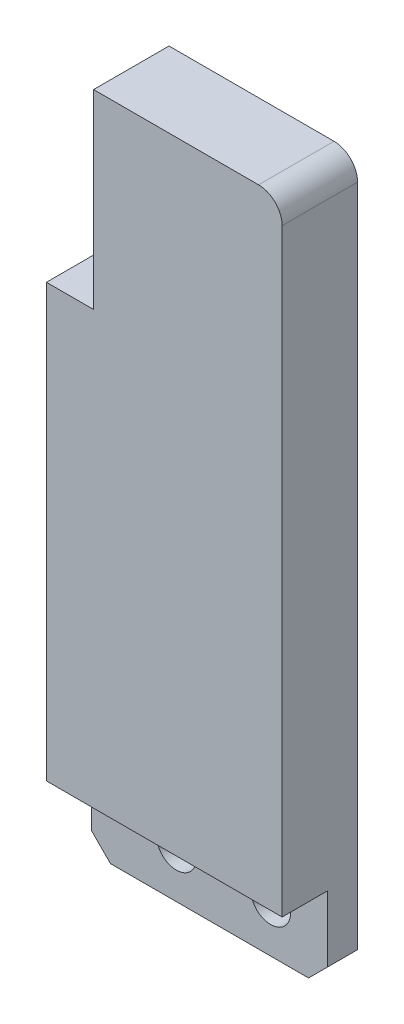
ISO-10303-21;
HEADER;
FILE_DESCRIPTION(('STEP AP214'),'2;1');
FILE_NAME('part.step','',(''),(''),'','','');
FILE_SCHEMA(('AUTOMOTIVE_DESIGN { 1 0 10303 214 1 1 1 1 }'));
ENDSEC;
DATA;
#1=APPLICATION_CONTEXT('core data for automotive mechanical design processes');
#2=APPLICATION_PROTOCOL_DEFINITION('international standard','automotive_design',2000,#1);
#3=PRODUCT_CONTEXT('',#1,'mechanical');
#4=PRODUCT('Part','Part','',(#3));
#5=PRODUCT_RELATED_PRODUCT_CATEGORY('part','',(#4));
#6=PRODUCT_DEFINITION_FORMATION('','',#4);
#7=PRODUCT_DEFINITION_CONTEXT('part definition',#1,'design');
#8=PRODUCT_DEFINITION('design','',#6,#7);
#9=PRODUCT_DEFINITION_SHAPE('','',#8);
#10=(LENGTH_UNIT() NAMED_UNIT(*) SI_UNIT(.MILLI.,.METRE.));
#11=(NAMED_UNIT(*) PLANE_ANGLE_UNIT() SI_UNIT($,.RADIAN.));
#12=(NAMED_UNIT(*) SI_UNIT($,.STERADIAN.) SOLID_ANGLE_UNIT());
#13=UNCERTAINTY_MEASURE_WITH_UNIT(LENGTH_MEASURE(1.E-05),#10,'distance_accuracy_value','');
#14=(GEOMETRIC_REPRESENTATION_CONTEXT(3) GLOBAL_UNCERTAINTY_ASSIGNED_CONTEXT((#13)) GLOBAL_UNIT_ASSIGNED_CONTEXT((#10,
#11,#12)) REPRESENTATION_CONTEXT('',''));
#15=CARTESIAN_POINT('',(0.,0.,0.));
#16=DIRECTION('',(0.,0.,1.));
#17=DIRECTION('',(1.,0.,0.));
#18=AXIS2_PLACEMENT_3D('',#15,#16,#17);
#19=CARTESIAN_POINT('',(12.5,-37.5,4.));
#20=DIRECTION('',(0.,1.,0.));
#21=DIRECTION('',(0.,0.,1.));
#22=AXIS2_PLACEMENT_3D('',#19,#20,#21);
#23=PLANE('',#22);
#24=DIRECTION('',(-1.,0.,0.));
#25=VECTOR('',#24,1.);
#26=CARTESIAN_POINT('',(-12.5,-37.5,-0.799999999999999));
#27=LINE('',#26,#25);
#28=CARTESIAN_POINT('',(10.5,-37.5,-0.799999999999999));
#29=VERTEX_POINT('',#28);
#30=CARTESIAN_POINT('',(-10.5,-37.5,-0.799999999999999));
#31=VERTEX_POINT('',#30);
#32=EDGE_CURVE('E163',#29,#31,#27,.T.);
#33=ORIENTED_EDGE('',*,*,#32,.T.);
#34=DIRECTION('',(0.,0.,-1.));
#35=VECTOR('',#34,1.);
#36=CARTESIAN_POINT('',(-10.5,-37.5,4.));
#37=LINE('',#36,#35);
#38=CARTESIAN_POINT('',(-10.5,-37.5,-4.));
#39=VERTEX_POINT('',#38);
#40=EDGE_CURVE('E219',#31,#39,#37,.T.);
#41=ORIENTED_EDGE('',*,*,#40,.T.);
#42=DIRECTION('',(1.,0.,0.));
#43=VECTOR('',#42,1.);
#44=CARTESIAN_POINT('',(12.5,-37.5,-4.));
#45=LINE('',#44,#43);
#46=CARTESIAN_POINT('',(10.5,-37.5,-4.));
#47=VERTEX_POINT('',#46);
#48=EDGE_CURVE('E202',#39,#47,#45,.T.);
#49=ORIENTED_EDGE('',*,*,#48,.T.);
#50=DIRECTION('',(0.,0.,1.));
#51=VECTOR('',#50,1.);
#52=CARTESIAN_POINT('',(10.5,-37.5,4.));
#53=LINE('',#52,#51);
#54=EDGE_CURVE('E217',#47,#29,#53,.T.);
#55=ORIENTED_EDGE('',*,*,#54,.T.);
#56=EDGE_LOOP('',(#33,#41,#49,#55));
#57=FACE_BOUND('',#56,.T.);
#58=ADVANCED_FACE('F41',(#57),#23,.F.);
#59=CARTESIAN_POINT('',(-12.5,-37.5,4.));
#60=DIRECTION('',(1.,0.,0.));
#61=DIRECTION('',(0.,0.,-1.));
#62=AXIS2_PLACEMENT_3D('',#59,#60,#61);
#63=PLANE('',#62);
#64=DIRECTION('',(0.,-1.,0.));
#65=VECTOR('',#64,1.);
#66=CARTESIAN_POINT('',(-12.5,-37.5,-4.));
#67=LINE('',#66,#65);
#68=CARTESIAN_POINT('',(-12.5,17.3,-4.));
#69=VERTEX_POINT('',#68);
#70=CARTESIAN_POINT('',(-12.5,-35.5,-4.));
#71=VERTEX_POINT('',#70);
#72=EDGE_CURVE('E186',#69,#71,#67,.T.);
#73=ORIENTED_EDGE('',*,*,#72,.T.);
#74=DIRECTION('',(0.,0.,1.));
#75=VECTOR('',#74,1.);
#76=CARTESIAN_POINT('',(-12.5,-35.5,4.));
#77=LINE('',#76,#75);
#78=CARTESIAN_POINT('',(-12.5,-35.5,-0.799999999999999));
#79=VERTEX_POINT('',#78);
#80=EDGE_CURVE('E65',#71,#79,#77,.T.);
#81=ORIENTED_EDGE('',*,*,#80,.T.);
#82=DIRECTION('',(0.,1.,0.));
#83=VECTOR('',#82,1.);
#84=CARTESIAN_POINT('',(-12.5,-37.5,-0.799999999999999));
#85=LINE('',#84,#83);
#86=CARTESIAN_POINT('',(-12.5,-28.5,-0.799999999999999));
#87=VERTEX_POINT('',#86);
#88=EDGE_CURVE('E161',#79,#87,#85,.T.);
#89=ORIENTED_EDGE('',*,*,#88,.T.);
#90=DIRECTION('',(0.,0.,1.));
#91=VECTOR('',#90,1.);
#92=CARTESIAN_POINT('',(-12.5,-28.5,-30.5706605111728));
#93=LINE('',#92,#91);
#94=CARTESIAN_POINT('',(-12.5,-28.5,4.));
#95=VERTEX_POINT('',#94);
#96=EDGE_CURVE('E159',#87,#95,#93,.T.);
#97=ORIENTED_EDGE('',*,*,#96,.T.);
#98=DIRECTION('',(0.,-1.,0.));
#99=VECTOR('',#98,1.);
#100=CARTESIAN_POINT('',(-12.5,-37.5,4.));
#101=LINE('',#100,#99);
#102=CARTESIAN_POINT('',(-12.5,17.3,4.));
#103=VERTEX_POINT('',#102);
#104=EDGE_CURVE('E191',#103,#95,#101,.T.);
#105=ORIENTED_EDGE('',*,*,#104,.F.);
#106=DIRECTION('',(0.,0.,1.));
#107=VECTOR('',#106,1.);
#108=CARTESIAN_POINT('',(-12.5,17.3,-4.));
#109=LINE('',#108,#107);
#110=EDGE_CURVE('E184',#69,#103,#109,.T.);
#111=ORIENTED_EDGE('',*,*,#110,.F.);
#112=EDGE_LOOP('',(#73,#81,#89,#97,#105,#111));
#113=FACE_BOUND('',#112,.T.);
#114=ADVANCED_FACE('F241',(#113),#63,.F.);
#115=CARTESIAN_POINT('',(12.5,-37.5,4.));
#116=DIRECTION('',(-1.,0.,0.));
#117=DIRECTION('',(0.,-1.,0.));
#118=AXIS2_PLACEMENT_3D('',#115,#116,#117);
#119=PLANE('',#118);
#120=DIRECTION('',(0.,-1.,0.));
#121=VECTOR('',#120,1.);
#122=CARTESIAN_POINT('',(12.5,-37.5,-0.799999999999999));
#123=LINE('',#122,#121);
#124=CARTESIAN_POINT('',(12.5,-28.5,-0.799999999999999));
#125=VERTEX_POINT('',#124);
#126=CARTESIAN_POINT('',(12.5,-35.5,-0.799999999999999));
#127=VERTEX_POINT('',#126);
#128=EDGE_CURVE('E156',#125,#127,#123,.T.);
#129=ORIENTED_EDGE('',*,*,#128,.T.);
#130=DIRECTION('',(0.,0.,-1.));
#131=VECTOR('',#130,1.);
#132=CARTESIAN_POINT('',(12.5,-35.5,4.));
#133=LINE('',#132,#131);
#134=CARTESIAN_POINT('',(12.5,-35.5,-4.));
#135=VERTEX_POINT('',#134);
#136=EDGE_CURVE('E12',#127,#135,#133,.T.);
#137=ORIENTED_EDGE('',*,*,#136,.T.);
#138=DIRECTION('',(0.,1.,0.));
#139=VECTOR('',#138,1.);
#140=CARTESIAN_POINT('',(12.5,-37.5,-4.));
#141=LINE('',#140,#139);
#142=CARTESIAN_POINT('',(12.5,35.,-4.));
#143=VERTEX_POINT('',#142);
#144=EDGE_CURVE('E205',#135,#143,#141,.T.);
#145=ORIENTED_EDGE('',*,*,#144,.T.);
#146=DIRECTION('',(0.,0.,-1.));
#147=VECTOR('',#146,1.);
#148=CARTESIAN_POINT('',(12.5,35.,4.));
#149=LINE('',#148,#147);
#150=CARTESIAN_POINT('',(12.5,35.,4.));
#151=VERTEX_POINT('',#150);
#152=EDGE_CURVE('E213',#143,#151,#149,.F.);
#153=ORIENTED_EDGE('',*,*,#152,.T.);
#154=DIRECTION('',(0.,1.,0.));
#155=VECTOR('',#154,1.);
#156=CARTESIAN_POINT('',(12.5,-37.5,4.));
#157=LINE('',#156,#155);
#158=CARTESIAN_POINT('',(12.5,-28.5,4.));
#159=VERTEX_POINT('',#158);
#160=EDGE_CURVE('E194',#159,#151,#157,.T.);
#161=ORIENTED_EDGE('',*,*,#160,.F.);
#162=DIRECTION('',(0.,0.,1.));
#163=VECTOR('',#162,1.);
#164=CARTESIAN_POINT('',(12.5,-28.5,-30.5706605111728));
#165=LINE('',#164,#163);
#166=EDGE_CURVE('E165',#125,#159,#165,.T.);
#167=ORIENTED_EDGE('',*,*,#166,.F.);
#168=EDGE_LOOP('',(#129,#137,#145,#153,#161,#167));
#169=FACE_BOUND('',#168,.T.);
#170=ADVANCED_FACE('F266',(#169),#119,.F.);
#171=CARTESIAN_POINT('',(12.5,37.5,4.));
#172=DIRECTION('',(0.,-1.,0.));
#173=DIRECTION('',(1.,0.,0.));
#174=AXIS2_PLACEMENT_3D('',#171,#172,#173);
#175=PLANE('',#174);
#176=DIRECTION('',(-1.,0.,0.));
#177=VECTOR('',#176,1.);
#178=CARTESIAN_POINT('',(12.5,37.5,4.));
#179=LINE('',#178,#177);
#180=CARTESIAN_POINT('',(10.,37.5,4.));
#181=VERTEX_POINT('',#180);
#182=CARTESIAN_POINT('',(-7.5,37.5,4.));
#183=VERTEX_POINT('',#182);
#184=EDGE_CURVE('E198',#181,#183,#179,.T.);
#185=ORIENTED_EDGE('',*,*,#184,.F.);
#186=DIRECTION('',(0.,0.,-1.));
#187=VECTOR('',#186,1.);
#188=CARTESIAN_POINT('',(10.,37.5,4.));
#189=LINE('',#188,#187);
#190=CARTESIAN_POINT('',(10.,37.5,-4.));
#191=VERTEX_POINT('',#190);
#192=EDGE_CURVE('E200',#181,#191,#189,.T.);
#193=ORIENTED_EDGE('',*,*,#192,.T.);
#194=DIRECTION('',(-1.,0.,0.));
#195=VECTOR('',#194,1.);
#196=CARTESIAN_POINT('',(12.5,37.5,-4.));
#197=LINE('',#196,#195);
#198=CARTESIAN_POINT('',(-7.5,37.5,-4.));
#199=VERTEX_POINT('',#198);
#200=EDGE_CURVE('E195',#191,#199,#197,.T.);
#201=ORIENTED_EDGE('',*,*,#200,.T.);
#202=DIRECTION('',(0.,0.,1.));
#203=VECTOR('',#202,1.);
#204=CARTESIAN_POINT('',(-7.5,37.5,-4.));
#205=LINE('',#204,#203);
#206=EDGE_CURVE('E187',#199,#183,#205,.T.);
#207=ORIENTED_EDGE('',*,*,#206,.T.);
#208=EDGE_LOOP('',(#185,#193,#201,#207));
#209=FACE_BOUND('',#208,.T.);
#210=ADVANCED_FACE('F256',(#209),#175,.F.);
#211=CARTESIAN_POINT('',(0.,0.,4.));
#212=DIRECTION('',(0.,0.,1.));
#213=DIRECTION('',(1.,0.,0.));
#214=AXIS2_PLACEMENT_3D('',#211,#212,#213);
#215=PLANE('',#214);
#216=ORIENTED_EDGE('',*,*,#160,.T.);
#217=CARTESIAN_POINT('',(10.,35.,4.));
#218=DIRECTION('',(0.,0.,1.));
#219=DIRECTION('',(1.,0.,0.));
#220=AXIS2_PLACEMENT_3D('',#217,#218,#219);
#221=CIRCLE('',#220,2.5);
#222=EDGE_CURVE('E215',#151,#181,#221,.T.);
#223=ORIENTED_EDGE('',*,*,#222,.T.);
#224=ORIENTED_EDGE('',*,*,#184,.T.);
#225=DIRECTION('',(0.,1.,0.));
#226=VECTOR('',#225,1.);
#227=CARTESIAN_POINT('',(-7.5,17.3,4.));
#228=LINE('',#227,#226);
#229=CARTESIAN_POINT('',(-7.5,17.3,4.));
#230=VERTEX_POINT('',#229);
#231=EDGE_CURVE('E176',#230,#183,#228,.T.);
#232=ORIENTED_EDGE('',*,*,#231,.F.);
#233=DIRECTION('',(1.,0.,0.));
#234=VECTOR('',#233,1.);
#235=CARTESIAN_POINT('',(-12.5,17.3,4.));
#236=LINE('',#235,#234);
#237=EDGE_CURVE('E171',#103,#230,#236,.T.);
#238=ORIENTED_EDGE('',*,*,#237,.F.);
#239=ORIENTED_EDGE('',*,*,#104,.T.);
#240=DIRECTION('',(-1.,0.,0.));
#241=VECTOR('',#240,1.);
#242=CARTESIAN_POINT('',(-12.5,-28.5,4.));
#243=LINE('',#242,#241);
#244=EDGE_CURVE('E155',#159,#95,#243,.T.);
#245=ORIENTED_EDGE('',*,*,#244,.F.);
#246=EDGE_LOOP('',(#216,#223,#224,#232,#238,#239,#245));
#247=FACE_BOUND('',#246,.T.);
#248=ADVANCED_FACE('F248',(#247),#215,.T.);
#249=CARTESIAN_POINT('',(0.,0.,-4.));
#250=DIRECTION('',(0.,0.,1.));
#251=DIRECTION('',(1.,0.,0.));
#252=AXIS2_PLACEMENT_3D('',#249,#250,#251);
#253=PLANE('',#252);
#254=CARTESIAN_POINT('',(6.48299999999958,-32.5028,-4.));
#255=DIRECTION('',(0.,0.,-1.));
#256=DIRECTION('',(-1.,0.,0.));
#257=AXIS2_PLACEMENT_3D('',#254,#255,#256);
#258=CIRCLE('',#257,2.1);
#259=CARTESIAN_POINT('',(4.38299999999958,-32.5028,-4.));
#260=VERTEX_POINT('',#259);
#261=EDGE_CURVE('E433',#260,#260,#258,.T.);
#262=ORIENTED_EDGE('',*,*,#261,.F.);
#263=EDGE_LOOP('',(#262));
#264=FACE_BOUND('',#263,.T.);
#265=CARTESIAN_POINT('',(-3.51700000000042,-32.5028,-4.));
#266=DIRECTION('',(0.,0.,-1.));
#267=DIRECTION('',(-1.,0.,0.));
#268=AXIS2_PLACEMENT_3D('',#265,#266,#267);
#269=CIRCLE('',#268,2.1);
#270=CARTESIAN_POINT('',(-5.61700000000041,-32.5028,-4.));
#271=VERTEX_POINT('',#270);
#272=EDGE_CURVE('E435',#271,#271,#269,.T.);
#273=ORIENTED_EDGE('',*,*,#272,.F.);
#274=EDGE_LOOP('',(#273));
#275=FACE_BOUND('',#274,.T.);
#276=ORIENTED_EDGE('',*,*,#48,.F.);
#277=DIRECTION('',(0.707106781186546,-0.707106781186549,0.));
#278=VECTOR('',#277,1.);
#279=CARTESIAN_POINT('',(-10.5,-37.5,-4.));
#280=LINE('',#279,#278);
#281=EDGE_CURVE('E224',#39,#71,#280,.F.);
#282=ORIENTED_EDGE('',*,*,#281,.T.);
#283=ORIENTED_EDGE('',*,*,#72,.F.);
#284=DIRECTION('',(1.,0.,0.));
#285=VECTOR('',#284,1.);
#286=CARTESIAN_POINT('',(-12.5,17.3,-4.));
#287=LINE('',#286,#285);
#288=CARTESIAN_POINT('',(-7.5,17.3,-4.));
#289=VERTEX_POINT('',#288);
#290=EDGE_CURVE('E172',#69,#289,#287,.T.);
#291=ORIENTED_EDGE('',*,*,#290,.T.);
#292=DIRECTION('',(0.,1.,0.));
#293=VECTOR('',#292,1.);
#294=CARTESIAN_POINT('',(-7.5,17.3,-4.));
#295=LINE('',#294,#293);
#296=EDGE_CURVE('E175',#289,#199,#295,.T.);
#297=ORIENTED_EDGE('',*,*,#296,.T.);
#298=ORIENTED_EDGE('',*,*,#200,.F.);
#299=CARTESIAN_POINT('',(10.,35.,-4.));
#300=DIRECTION('',(0.,0.,1.));
#301=DIRECTION('',(1.,0.,0.));
#302=AXIS2_PLACEMENT_3D('',#299,#300,#301);
#303=CIRCLE('',#302,2.5);
#304=EDGE_CURVE('E210',#191,#143,#303,.F.);
#305=ORIENTED_EDGE('',*,*,#304,.T.);
#306=ORIENTED_EDGE('',*,*,#144,.F.);
#307=DIRECTION('',(0.707106781186549,0.707106781186546,0.));
#308=VECTOR('',#307,1.);
#309=CARTESIAN_POINT('',(12.5,-35.5,-4.));
#310=LINE('',#309,#308);
#311=EDGE_CURVE('E222',#135,#47,#310,.F.);
#312=ORIENTED_EDGE('',*,*,#311,.T.);
#313=EDGE_LOOP('',(#276,#282,#283,#291,#297,#298,#305,#306,#312));
#314=FACE_BOUND('',#313,.T.);
#315=ADVANCED_FACE('F239',(#264,#275,#314),#253,.F.);
#316=CARTESIAN_POINT('',(-12.5,17.3,-4.));
#317=DIRECTION('',(0.,-1.,0.));
#318=DIRECTION('',(0.,0.,-1.));
#319=AXIS2_PLACEMENT_3D('',#316,#317,#318);
#320=PLANE('',#319);
#321=ORIENTED_EDGE('',*,*,#237,.T.);
#322=DIRECTION('',(0.,0.,1.));
#323=VECTOR('',#322,1.);
#324=CARTESIAN_POINT('',(-7.5,17.3,-4.));
#325=LINE('',#324,#323);
#326=EDGE_CURVE('E179',#289,#230,#325,.T.);
#327=ORIENTED_EDGE('',*,*,#326,.F.);
#328=ORIENTED_EDGE('',*,*,#290,.F.);
#329=ORIENTED_EDGE('',*,*,#110,.T.);
#330=EDGE_LOOP('',(#321,#327,#328,#329));
#331=FACE_BOUND('',#330,.T.);
#332=ADVANCED_FACE('F245',(#331),#320,.F.);
#333=CARTESIAN_POINT('',(-7.5,17.3,-4.));
#334=DIRECTION('',(1.,0.,0.));
#335=DIRECTION('',(0.,0.,-1.));
#336=AXIS2_PLACEMENT_3D('',#333,#334,#335);
#337=PLANE('',#336);
#338=CARTESIAN_POINT('',(-7.5,22.5,0.));
#339=DIRECTION('',(-1.,0.,0.));
#340=DIRECTION('',(0.,0.,1.));
#341=AXIS2_PLACEMENT_3D('',#338,#339,#340);
#342=CIRCLE('',#341,2.09999999999999);
#343=CARTESIAN_POINT('',(-7.5,22.5,2.09999999999999));
#344=VERTEX_POINT('',#343);
#345=EDGE_CURVE('E143',#344,#344,#342,.T.);
#346=ORIENTED_EDGE('',*,*,#345,.F.);
#347=EDGE_LOOP('',(#346));
#348=FACE_BOUND('',#347,.T.);
#349=CARTESIAN_POINT('',(-7.5,32.5,0.));
#350=DIRECTION('',(-1.,0.,0.));
#351=DIRECTION('',(0.,0.,1.));
#352=AXIS2_PLACEMENT_3D('',#349,#350,#351);
#353=CIRCLE('',#352,2.09999999999999);
#354=CARTESIAN_POINT('',(-7.5,32.5,2.09999999999999));
#355=VERTEX_POINT('',#354);
#356=EDGE_CURVE('E142',#355,#355,#353,.T.);
#357=ORIENTED_EDGE('',*,*,#356,.F.);
#358=EDGE_LOOP('',(#357));
#359=FACE_BOUND('',#358,.T.);
#360=ORIENTED_EDGE('',*,*,#231,.T.);
#361=ORIENTED_EDGE('',*,*,#206,.F.);
#362=ORIENTED_EDGE('',*,*,#296,.F.);
#363=ORIENTED_EDGE('',*,*,#326,.T.);
#364=EDGE_LOOP('',(#360,#361,#362,#363));
#365=FACE_BOUND('',#364,.T.);
#366=ADVANCED_FACE('F253',(#348,#359,#365),#337,.F.);
#367=CARTESIAN_POINT('',(-12.5,-28.5,-30.5706605111728));
#368=DIRECTION('',(0.,1.,0.));
#369=DIRECTION('',(0.,0.,1.));
#370=AXIS2_PLACEMENT_3D('',#367,#368,#369);
#371=PLANE('',#370);
#372=DIRECTION('',(1.,0.,0.));
#373=VECTOR('',#372,1.);
#374=CARTESIAN_POINT('',(-12.5,-28.5,-0.799999999999999));
#375=LINE('',#374,#373);
#376=EDGE_CURVE('E158',#87,#125,#375,.T.);
#377=ORIENTED_EDGE('',*,*,#376,.T.);
#378=ORIENTED_EDGE('',*,*,#166,.T.);
#379=ORIENTED_EDGE('',*,*,#244,.T.);
#380=ORIENTED_EDGE('',*,*,#96,.F.);
#381=EDGE_LOOP('',(#377,#378,#379,#380));
#382=FACE_BOUND('',#381,.T.);
#383=ADVANCED_FACE('F270',(#382),#371,.F.);
#384=CARTESIAN_POINT('',(0.,0.,-0.8));
#385=DIRECTION('',(0.,0.,1.));
#386=DIRECTION('',(1.,0.,0.));
#387=AXIS2_PLACEMENT_3D('',#384,#385,#386);
#388=PLANE('',#387);
#389=CARTESIAN_POINT('',(6.48299999999958,-32.5028,-0.8));
#390=DIRECTION('',(0.,0.,1.));
#391=DIRECTION('',(1.,0.,0.));
#392=AXIS2_PLACEMENT_3D('',#389,#390,#391);
#393=CIRCLE('',#392,2.1);
#394=CARTESIAN_POINT('',(8.58299999999958,-32.5028,-0.8));
#395=VERTEX_POINT('',#394);
#396=EDGE_CURVE('E45',#395,#395,#393,.T.);
#397=ORIENTED_EDGE('',*,*,#396,.F.);
#398=EDGE_LOOP('',(#397));
#399=FACE_BOUND('',#398,.T.);
#400=CARTESIAN_POINT('',(-3.51700000000042,-32.5028,-0.8));
#401=DIRECTION('',(0.,0.,1.));
#402=DIRECTION('',(1.,0.,0.));
#403=AXIS2_PLACEMENT_3D('',#400,#401,#402);
#404=CIRCLE('',#403,2.1);
#405=CARTESIAN_POINT('',(-1.41700000000042,-32.5028,-0.8));
#406=VERTEX_POINT('',#405);
#407=EDGE_CURVE('E149',#406,#406,#404,.T.);
#408=ORIENTED_EDGE('',*,*,#407,.F.);
#409=EDGE_LOOP('',(#408));
#410=FACE_BOUND('',#409,.T.);
#411=ORIENTED_EDGE('',*,*,#88,.F.);
#412=DIRECTION('',(-0.707106781186546,0.707106781186549,0.));
#413=VECTOR('',#412,1.);
#414=CARTESIAN_POINT('',(-24.,-23.9999999999999,-0.8));
#415=LINE('',#414,#413);
#416=EDGE_CURVE('E50',#79,#31,#415,.F.);
#417=ORIENTED_EDGE('',*,*,#416,.T.);
#418=ORIENTED_EDGE('',*,*,#32,.F.);
#419=DIRECTION('',(-0.707106781186549,-0.707106781186546,0.));
#420=VECTOR('',#419,1.);
#421=CARTESIAN_POINT('',(24.,-24.0000000000001,-0.8));
#422=LINE('',#421,#420);
#423=EDGE_CURVE('E57',#29,#127,#422,.F.);
#424=ORIENTED_EDGE('',*,*,#423,.T.);
#425=ORIENTED_EDGE('',*,*,#128,.F.);
#426=ORIENTED_EDGE('',*,*,#376,.F.);
#427=EDGE_LOOP('',(#411,#417,#418,#424,#425,#426));
#428=FACE_BOUND('',#427,.T.);
#429=ADVANCED_FACE('F229',(#399,#410,#428),#388,.T.);
#430=CARTESIAN_POINT('',(10.,35.,4.));
#431=DIRECTION('',(0.,0.,-1.));
#432=DIRECTION('',(-1.,0.,0.));
#433=AXIS2_PLACEMENT_3D('',#430,#431,#432);
#434=CYLINDRICAL_SURFACE('',#433,2.5);
#435=ORIENTED_EDGE('',*,*,#222,.F.);
#436=ORIENTED_EDGE('',*,*,#152,.F.);
#437=ORIENTED_EDGE('',*,*,#304,.F.);
#438=ORIENTED_EDGE('',*,*,#192,.F.);
#439=EDGE_LOOP('',(#435,#436,#437,#438));
#440=FACE_BOUND('',#439,.T.);
#441=ADVANCED_FACE('F263',(#440),#434,.T.);
#442=CARTESIAN_POINT('',(-10.5,-37.5,4.));
#443=DIRECTION('',(0.707106781186549,0.707106781186546,0.));
#444=DIRECTION('',(0.,0.,-1.));
#445=AXIS2_PLACEMENT_3D('',#442,#443,#444);
#446=PLANE('',#445);
#447=ORIENTED_EDGE('',*,*,#416,.F.);
#448=ORIENTED_EDGE('',*,*,#80,.F.);
#449=ORIENTED_EDGE('',*,*,#281,.F.);
#450=ORIENTED_EDGE('',*,*,#40,.F.);
#451=EDGE_LOOP('',(#447,#448,#449,#450));
#452=FACE_BOUND('',#451,.T.);
#453=ADVANCED_FACE('F236',(#452),#446,.F.);
#454=CARTESIAN_POINT('',(12.5,-35.5,4.));
#455=DIRECTION('',(-0.707106781186546,0.707106781186549,0.));
#456=DIRECTION('',(0.,0.,-1.));
#457=AXIS2_PLACEMENT_3D('',#454,#455,#456);
#458=PLANE('',#457);
#459=ORIENTED_EDGE('',*,*,#423,.F.);
#460=ORIENTED_EDGE('',*,*,#54,.F.);
#461=ORIENTED_EDGE('',*,*,#311,.F.);
#462=ORIENTED_EDGE('',*,*,#136,.F.);
#463=EDGE_LOOP('',(#459,#460,#461,#462));
#464=FACE_BOUND('',#463,.T.);
#465=ADVANCED_FACE('F43',(#464),#458,.F.);
#466=CARTESIAN_POINT('',(-0.699999999999999,32.5,0.));
#467=DIRECTION('',(-1.,0.,0.));
#468=DIRECTION('',(0.,0.,1.));
#469=AXIS2_PLACEMENT_3D('',#466,#467,#468);
#470=CONICAL_SURFACE('',#469,2.09999999999999,1.02974425867666);
#471=CARTESIAN_POINT('',(0.561807299957868,32.5,0.));
#472=VERTEX_POINT('',#471);
#473=VERTEX_LOOP('',#472);
#474=FACE_BOUND('',#473,.T.);
#475=CARTESIAN_POINT('',(-0.699999999999999,32.5,0.));
#476=DIRECTION('',(-1.,0.,0.));
#477=DIRECTION('',(0.,0.,1.));
#478=AXIS2_PLACEMENT_3D('',#475,#476,#477);
#479=CIRCLE('',#478,2.09999999999999);
#480=CARTESIAN_POINT('',(-0.699999999999999,32.5,2.09999999999999));
#481=VERTEX_POINT('',#480);
#482=EDGE_CURVE('E146',#481,#481,#479,.T.);
#483=ORIENTED_EDGE('',*,*,#482,.T.);
#484=EDGE_LOOP('',(#483));
#485=FACE_BOUND('',#484,.T.);
#486=ADVANCED_FACE('F274',(#474,#485),#470,.F.);
#487=CARTESIAN_POINT('',(-7.5,32.5,0.));
#488=DIRECTION('',(-1.,0.,0.));
#489=DIRECTION('',(0.,0.,1.));
#490=AXIS2_PLACEMENT_3D('',#487,#488,#489);
#491=CYLINDRICAL_SURFACE('',#490,2.09999999999999);
#492=ORIENTED_EDGE('',*,*,#482,.F.);
#493=EDGE_LOOP('',(#492));
#494=FACE_BOUND('',#493,.T.);
#495=ORIENTED_EDGE('',*,*,#356,.T.);
#496=EDGE_LOOP('',(#495));
#497=FACE_BOUND('',#496,.T.);
#498=ADVANCED_FACE('F136',(#494,#497),#491,.F.);
#499=CARTESIAN_POINT('',(-0.699999999999999,22.5,0.));
#500=DIRECTION('',(-1.,0.,0.));
#501=DIRECTION('',(0.,0.,1.));
#502=AXIS2_PLACEMENT_3D('',#499,#500,#501);
#503=CONICAL_SURFACE('',#502,2.09999999999999,1.02974425867665);
#504=CARTESIAN_POINT('',(0.561807299957868,22.5,0.));
#505=VERTEX_POINT('',#504);
#506=VERTEX_LOOP('',#505);
#507=FACE_BOUND('',#506,.T.);
#508=CARTESIAN_POINT('',(-0.699999999999999,22.5,0.));
#509=DIRECTION('',(-1.,0.,0.));
#510=DIRECTION('',(0.,0.,1.));
#511=AXIS2_PLACEMENT_3D('',#508,#509,#510);
#512=CIRCLE('',#511,2.09999999999999);
#513=CARTESIAN_POINT('',(-0.699999999999999,22.5,2.09999999999999));
#514=VERTEX_POINT('',#513);
#515=EDGE_CURVE('E140',#514,#514,#512,.T.);
#516=ORIENTED_EDGE('',*,*,#515,.T.);
#517=EDGE_LOOP('',(#516));
#518=FACE_BOUND('',#517,.T.);
#519=ADVANCED_FACE('F132',(#507,#518),#503,.F.);
#520=CARTESIAN_POINT('',(-7.5,22.5,0.));
#521=DIRECTION('',(-1.,0.,0.));
#522=DIRECTION('',(0.,0.,1.));
#523=AXIS2_PLACEMENT_3D('',#520,#521,#522);
#524=CYLINDRICAL_SURFACE('',#523,2.09999999999999);
#525=ORIENTED_EDGE('',*,*,#515,.F.);
#526=EDGE_LOOP('',(#525));
#527=FACE_BOUND('',#526,.T.);
#528=ORIENTED_EDGE('',*,*,#345,.T.);
#529=EDGE_LOOP('',(#528));
#530=FACE_BOUND('',#529,.T.);
#531=ADVANCED_FACE('F135',(#527,#530),#524,.F.);
#532=CARTESIAN_POINT('',(-3.51700000000042,-32.5028,-4.));
#533=DIRECTION('',(0.,0.,-1.));
#534=DIRECTION('',(-1.,0.,0.));
#535=AXIS2_PLACEMENT_3D('',#532,#533,#534);
#536=CYLINDRICAL_SURFACE('',#535,2.1);
#537=ORIENTED_EDGE('',*,*,#407,.T.);
#538=EDGE_LOOP('',(#537));
#539=FACE_BOUND('',#538,.T.);
#540=ORIENTED_EDGE('',*,*,#272,.T.);
#541=EDGE_LOOP('',(#540));
#542=FACE_BOUND('',#541,.T.);
#543=ADVANCED_FACE('F398',(#539,#542),#536,.F.);
#544=CARTESIAN_POINT('',(6.48299999999958,-32.5028,-4.));
#545=DIRECTION('',(0.,0.,-1.));
#546=DIRECTION('',(-1.,0.,0.));
#547=AXIS2_PLACEMENT_3D('',#544,#545,#546);
#548=CYLINDRICAL_SURFACE('',#547,2.1);
#549=ORIENTED_EDGE('',*,*,#396,.T.);
#550=EDGE_LOOP('',(#549));
#551=FACE_BOUND('',#550,.T.);
#552=ORIENTED_EDGE('',*,*,#261,.T.);
#553=EDGE_LOOP('',(#552));
#554=FACE_BOUND('',#553,.T.);
#555=ADVANCED_FACE('F415',(#551,#554),#548,.F.);
#556=CLOSED_SHELL('',(#58,#114,#170,#210,#248,#315,#332,#366,#383,#429,#441,#453,#465,#486,#498,
#519,#531,#543,#555));
#557=MANIFOLD_SOLID_BREP('B2',#556);
#558=ADVANCED_BREP_SHAPE_REPRESENTATION('',(#18,#557),#14);
#559=SHAPE_DEFINITION_REPRESENTATION(#9,#558);
ENDSEC;
END-ISO-10303-21;
